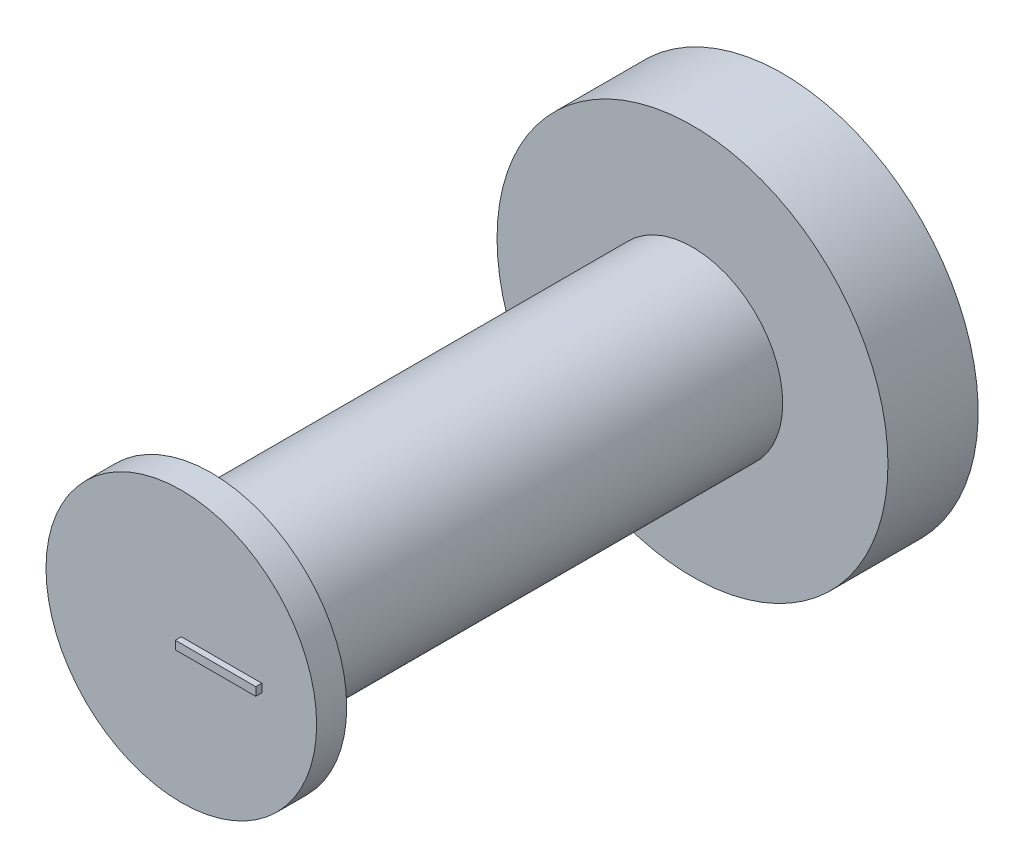
ISO-10303-21;
HEADER;
FILE_DESCRIPTION(('STEP AP214'),'2;1');
FILE_NAME('part.step','',(''),(''),'','','');
FILE_SCHEMA(('AUTOMOTIVE_DESIGN { 1 0 10303 214 1 1 1 1 }'));
ENDSEC;
DATA;
#1=APPLICATION_CONTEXT('core data for automotive mechanical design processes');
#2=APPLICATION_PROTOCOL_DEFINITION('international standard','automotive_design',2000,#1);
#3=PRODUCT_CONTEXT('',#1,'mechanical');
#4=PRODUCT('Part','Part','',(#3));
#5=PRODUCT_RELATED_PRODUCT_CATEGORY('part','',(#4));
#6=PRODUCT_DEFINITION_FORMATION('','',#4);
#7=PRODUCT_DEFINITION_CONTEXT('part definition',#1,'design');
#8=PRODUCT_DEFINITION('design','',#6,#7);
#9=PRODUCT_DEFINITION_SHAPE('','',#8);
#10=(LENGTH_UNIT() NAMED_UNIT(*) SI_UNIT(.MILLI.,.METRE.));
#11=(NAMED_UNIT(*) PLANE_ANGLE_UNIT() SI_UNIT($,.RADIAN.));
#12=(NAMED_UNIT(*) SI_UNIT($,.STERADIAN.) SOLID_ANGLE_UNIT());
#13=UNCERTAINTY_MEASURE_WITH_UNIT(LENGTH_MEASURE(1.E-05),#10,'distance_accuracy_value','');
#14=(GEOMETRIC_REPRESENTATION_CONTEXT(3) GLOBAL_UNCERTAINTY_ASSIGNED_CONTEXT((#13)) GLOBAL_UNIT_ASSIGNED_CONTEXT((#10,
#11,#12)) REPRESENTATION_CONTEXT('',''));
#15=CARTESIAN_POINT('',(0.,0.,0.));
#16=DIRECTION('',(0.,0.,1.));
#17=DIRECTION('',(1.,0.,0.));
#18=AXIS2_PLACEMENT_3D('',#15,#16,#17);
#19=CARTESIAN_POINT('',(0.,0.,10.35));
#20=DIRECTION('',(0.,0.,1.));
#21=DIRECTION('',(1.,0.,0.));
#22=AXIS2_PLACEMENT_3D('',#19,#20,#21);
#23=PLANE('',#22);
#24=CARTESIAN_POINT('',(0.,0.,10.35));
#25=DIRECTION('',(0.,0.,1.));
#26=DIRECTION('',(1.,0.,0.));
#27=AXIS2_PLACEMENT_3D('',#24,#25,#26);
#28=CIRCLE('',#27,10.35);
#29=CARTESIAN_POINT('',(10.35,0.,10.35));
#30=VERTEX_POINT('',#29);
#31=EDGE_CURVE('E37',#30,#30,#28,.T.);
#32=ORIENTED_EDGE('',*,*,#31,.F.);
#33=EDGE_LOOP('',(#32));
#34=FACE_BOUND('',#33,.T.);
#35=CARTESIAN_POINT('',(0.,0.,10.35));
#36=DIRECTION('',(0.,0.,1.));
#37=DIRECTION('',(1.,0.,0.));
#38=AXIS2_PLACEMENT_3D('',#35,#36,#37);
#39=CIRCLE('',#38,22.425);
#40=CARTESIAN_POINT('',(22.425,0.,10.35));
#41=VERTEX_POINT('',#40);
#42=EDGE_CURVE('E103',#41,#41,#39,.T.);
#43=ORIENTED_EDGE('',*,*,#42,.T.);
#44=EDGE_LOOP('',(#43));
#45=FACE_BOUND('',#44,.T.);
#46=ADVANCED_FACE('F33',(#34,#45),#23,.T.);
#47=CARTESIAN_POINT('',(0.,0.,69.));
#48=DIRECTION('',(0.,0.,1.));
#49=DIRECTION('',(1.,0.,0.));
#50=AXIS2_PLACEMENT_3D('',#47,#48,#49);
#51=PLANE('',#50);
#52=CARTESIAN_POINT('',(0.,0.,69.));
#53=DIRECTION('',(0.,0.,1.));
#54=DIRECTION('',(1.,0.,0.));
#55=AXIS2_PLACEMENT_3D('',#52,#53,#54);
#56=CIRCLE('',#55,15.525);
#57=CARTESIAN_POINT('',(15.525,0.,69.));
#58=VERTEX_POINT('',#57);
#59=EDGE_CURVE('E112',#58,#58,#56,.T.);
#60=ORIENTED_EDGE('',*,*,#59,.T.);
#61=EDGE_LOOP('',(#60));
#62=FACE_BOUND('',#61,.T.);
#63=DIRECTION('',(1.,0.,0.));
#64=VECTOR('',#63,1.);
#65=CARTESIAN_POINT('',(0.,0.,69.));
#66=LINE('',#65,#64);
#67=CARTESIAN_POINT('',(0.,0.,69.));
#68=VERTEX_POINT('',#67);
#69=CARTESIAN_POINT('',(9.23130868630594,0.,69.));
#70=VERTEX_POINT('',#69);
#71=EDGE_CURVE('E89',#68,#70,#66,.T.);
#72=ORIENTED_EDGE('',*,*,#71,.F.);
#73=DIRECTION('',(0.,-1.,0.));
#74=VECTOR('',#73,1.);
#75=CARTESIAN_POINT('',(0.,0.,69.));
#76=LINE('',#75,#74);
#77=CARTESIAN_POINT('',(0.,0.956903949190487,69.));
#78=VERTEX_POINT('',#77);
#79=EDGE_CURVE('E100',#78,#68,#76,.T.);
#80=ORIENTED_EDGE('',*,*,#79,.F.);
#81=DIRECTION('',(-1.,0.,0.));
#82=VECTOR('',#81,1.);
#83=CARTESIAN_POINT('',(0.,0.956903949190487,69.));
#84=LINE('',#83,#82);
#85=CARTESIAN_POINT('',(9.23130868630594,0.956903949190487,69.));
#86=VERTEX_POINT('',#85);
#87=EDGE_CURVE('E70',#86,#78,#84,.T.);
#88=ORIENTED_EDGE('',*,*,#87,.F.);
#89=DIRECTION('',(0.,1.,0.));
#90=VECTOR('',#89,1.);
#91=CARTESIAN_POINT('',(9.23130868630594,0.,69.));
#92=LINE('',#91,#90);
#93=EDGE_CURVE('E105',#70,#86,#92,.T.);
#94=ORIENTED_EDGE('',*,*,#93,.F.);
#95=EDGE_LOOP('',(#72,#80,#88,#94));
#96=FACE_BOUND('',#95,.T.);
#97=ADVANCED_FACE('F129',(#62,#96),#51,.T.);
#98=CARTESIAN_POINT('',(0.,0.,65.55));
#99=DIRECTION('',(0.,0.,-1.));
#100=DIRECTION('',(-1.,0.,0.));
#101=AXIS2_PLACEMENT_3D('',#98,#99,#100);
#102=CYLINDRICAL_SURFACE('',#101,10.35);
#103=CARTESIAN_POINT('',(0.,0.,65.55));
#104=DIRECTION('',(0.,0.,1.));
#105=DIRECTION('',(1.,0.,0.));
#106=AXIS2_PLACEMENT_3D('',#103,#104,#105);
#107=CIRCLE('',#106,10.35);
#108=CARTESIAN_POINT('',(10.35,0.,65.55));
#109=VERTEX_POINT('',#108);
#110=EDGE_CURVE('E11',#109,#109,#107,.T.);
#111=ORIENTED_EDGE('',*,*,#110,.F.);
#112=EDGE_LOOP('',(#111));
#113=FACE_BOUND('',#112,.T.);
#114=ORIENTED_EDGE('',*,*,#31,.T.);
#115=EDGE_LOOP('',(#114));
#116=FACE_BOUND('',#115,.T.);
#117=ADVANCED_FACE('F123',(#113,#116),#102,.T.);
#118=CARTESIAN_POINT('',(0.,0.,65.55));
#119=DIRECTION('',(0.,0.,1.));
#120=DIRECTION('',(1.,0.,0.));
#121=AXIS2_PLACEMENT_3D('',#118,#119,#120);
#122=PLANE('',#121);
#123=CARTESIAN_POINT('',(0.,0.,65.55));
#124=DIRECTION('',(0.,0.,1.));
#125=DIRECTION('',(1.,0.,0.));
#126=AXIS2_PLACEMENT_3D('',#123,#124,#125);
#127=CIRCLE('',#126,15.525);
#128=CARTESIAN_POINT('',(15.525,0.,65.55));
#129=VERTEX_POINT('',#128);
#130=EDGE_CURVE('E111',#129,#129,#127,.T.);
#131=ORIENTED_EDGE('',*,*,#130,.F.);
#132=EDGE_LOOP('',(#131));
#133=FACE_BOUND('',#132,.T.);
#134=ORIENTED_EDGE('',*,*,#110,.T.);
#135=EDGE_LOOP('',(#134));
#136=FACE_BOUND('',#135,.T.);
#137=ADVANCED_FACE('F120',(#133,#136),#122,.F.);
#138=CARTESIAN_POINT('',(0.,0.,69.));
#139=DIRECTION('',(0.,0.,-1.));
#140=DIRECTION('',(-1.,0.,0.));
#141=AXIS2_PLACEMENT_3D('',#138,#139,#140);
#142=CYLINDRICAL_SURFACE('',#141,15.525);
#143=ORIENTED_EDGE('',*,*,#59,.F.);
#144=EDGE_LOOP('',(#143));
#145=FACE_BOUND('',#144,.T.);
#146=ORIENTED_EDGE('',*,*,#130,.T.);
#147=EDGE_LOOP('',(#146));
#148=FACE_BOUND('',#147,.T.);
#149=ADVANCED_FACE('F118',(#145,#148),#142,.T.);
#150=CARTESIAN_POINT('',(0.,0.,69.69));
#151=DIRECTION('',(1.,0.,0.));
#152=DIRECTION('',(0.,0.,-1.));
#153=AXIS2_PLACEMENT_3D('',#150,#151,#152);
#154=PLANE('',#153);
#155=ORIENTED_EDGE('',*,*,#79,.T.);
#156=DIRECTION('',(0.,0.,-1.));
#157=VECTOR('',#156,1.);
#158=CARTESIAN_POINT('',(0.,0.,69.69));
#159=LINE('',#158,#157);
#160=CARTESIAN_POINT('',(0.,0.,69.69));
#161=VERTEX_POINT('',#160);
#162=EDGE_CURVE('E92',#161,#68,#159,.T.);
#163=ORIENTED_EDGE('',*,*,#162,.F.);
#164=DIRECTION('',(0.,-1.,0.));
#165=VECTOR('',#164,1.);
#166=CARTESIAN_POINT('',(0.,0.,69.69));
#167=LINE('',#166,#165);
#168=CARTESIAN_POINT('',(0.,0.956903949190487,69.69));
#169=VERTEX_POINT('',#168);
#170=EDGE_CURVE('E82',#169,#161,#167,.T.);
#171=ORIENTED_EDGE('',*,*,#170,.F.);
#172=DIRECTION('',(0.,0.,-1.));
#173=VECTOR('',#172,1.);
#174=CARTESIAN_POINT('',(0.,0.956903949190487,69.69));
#175=LINE('',#174,#173);
#176=EDGE_CURVE('E96',#169,#78,#175,.T.);
#177=ORIENTED_EDGE('',*,*,#176,.T.);
#178=EDGE_LOOP('',(#155,#163,#171,#177));
#179=FACE_BOUND('',#178,.T.);
#180=ADVANCED_FACE('F163',(#179),#154,.F.);
#181=CARTESIAN_POINT('',(0.,0.,69.69));
#182=DIRECTION('',(0.,1.,0.));
#183=DIRECTION('',(0.,0.,1.));
#184=AXIS2_PLACEMENT_3D('',#181,#182,#183);
#185=PLANE('',#184);
#186=ORIENTED_EDGE('',*,*,#71,.T.);
#187=DIRECTION('',(0.,0.,-1.));
#188=VECTOR('',#187,1.);
#189=CARTESIAN_POINT('',(9.23130868630594,0.,69.69));
#190=LINE('',#189,#188);
#191=CARTESIAN_POINT('',(9.23130868630594,0.,69.69));
#192=VERTEX_POINT('',#191);
#193=EDGE_CURVE('E86',#192,#70,#190,.T.);
#194=ORIENTED_EDGE('',*,*,#193,.F.);
#195=DIRECTION('',(1.,0.,0.));
#196=VECTOR('',#195,1.);
#197=CARTESIAN_POINT('',(0.,0.,69.69));
#198=LINE('',#197,#196);
#199=EDGE_CURVE('E77',#161,#192,#198,.T.);
#200=ORIENTED_EDGE('',*,*,#199,.F.);
#201=ORIENTED_EDGE('',*,*,#162,.T.);
#202=EDGE_LOOP('',(#186,#194,#200,#201));
#203=FACE_BOUND('',#202,.T.);
#204=ADVANCED_FACE('F87',(#203),#185,.F.);
#205=CARTESIAN_POINT('',(9.23130868630594,0.,69.69));
#206=DIRECTION('',(-1.,0.,0.));
#207=DIRECTION('',(0.,0.,1.));
#208=AXIS2_PLACEMENT_3D('',#205,#206,#207);
#209=PLANE('',#208);
#210=ORIENTED_EDGE('',*,*,#93,.T.);
#211=DIRECTION('',(0.,0.,-1.));
#212=VECTOR('',#211,1.);
#213=CARTESIAN_POINT('',(9.23130868630594,0.956903949190487,69.69));
#214=LINE('',#213,#212);
#215=CARTESIAN_POINT('',(9.23130868630594,0.956903949190487,69.69));
#216=VERTEX_POINT('',#215);
#217=EDGE_CURVE('E48',#216,#86,#214,.T.);
#218=ORIENTED_EDGE('',*,*,#217,.F.);
#219=DIRECTION('',(0.,1.,0.));
#220=VECTOR('',#219,1.);
#221=CARTESIAN_POINT('',(9.23130868630594,0.,69.69));
#222=LINE('',#221,#220);
#223=EDGE_CURVE('E80',#192,#216,#222,.T.);
#224=ORIENTED_EDGE('',*,*,#223,.F.);
#225=ORIENTED_EDGE('',*,*,#193,.T.);
#226=EDGE_LOOP('',(#210,#218,#224,#225));
#227=FACE_BOUND('',#226,.T.);
#228=ADVANCED_FACE('F94',(#227),#209,.F.);
#229=CARTESIAN_POINT('',(0.,0.956903949190487,69.69));
#230=DIRECTION('',(0.,-1.,0.));
#231=DIRECTION('',(0.,0.,-1.));
#232=AXIS2_PLACEMENT_3D('',#229,#230,#231);
#233=PLANE('',#232);
#234=ORIENTED_EDGE('',*,*,#87,.T.);
#235=ORIENTED_EDGE('',*,*,#176,.F.);
#236=DIRECTION('',(-1.,0.,0.));
#237=VECTOR('',#236,1.);
#238=CARTESIAN_POINT('',(0.,0.956903949190487,69.69));
#239=LINE('',#238,#237);
#240=EDGE_CURVE('E56',#216,#169,#239,.T.);
#241=ORIENTED_EDGE('',*,*,#240,.F.);
#242=ORIENTED_EDGE('',*,*,#217,.T.);
#243=EDGE_LOOP('',(#234,#235,#241,#242));
#244=FACE_BOUND('',#243,.T.);
#245=ADVANCED_FACE('F154',(#244),#233,.F.);
#246=CARTESIAN_POINT('',(0.,0.,69.69));
#247=DIRECTION('',(0.,0.,-1.));
#248=DIRECTION('',(-1.,0.,0.));
#249=AXIS2_PLACEMENT_3D('',#246,#247,#248);
#250=PLANE('',#249);
#251=ORIENTED_EDGE('',*,*,#170,.T.);
#252=ORIENTED_EDGE('',*,*,#199,.T.);
#253=ORIENTED_EDGE('',*,*,#223,.T.);
#254=ORIENTED_EDGE('',*,*,#240,.T.);
#255=EDGE_LOOP('',(#251,#252,#253,#254));
#256=FACE_BOUND('',#255,.T.);
#257=ADVANCED_FACE('F78',(#256),#250,.F.);
#258=CARTESIAN_POINT('',(0.,0.,14.49));
#259=DIRECTION('',(0.,0.,-1.));
#260=DIRECTION('',(-1.,0.,0.));
#261=AXIS2_PLACEMENT_3D('',#258,#259,#260);
#262=CYLINDRICAL_SURFACE('',#261,22.425);
#263=ORIENTED_EDGE('',*,*,#42,.F.);
#264=EDGE_LOOP('',(#263));
#265=FACE_BOUND('',#264,.T.);
#266=CARTESIAN_POINT('',(0.,0.,0.));
#267=DIRECTION('',(0.,0.,-1.));
#268=DIRECTION('',(-1.,0.,0.));
#269=AXIS2_PLACEMENT_3D('',#266,#267,#268);
#270=CIRCLE('',#269,22.425);
#271=CARTESIAN_POINT('',(-22.425,0.,0.));
#272=VERTEX_POINT('',#271);
#273=EDGE_CURVE('E139',#272,#272,#270,.T.);
#274=ORIENTED_EDGE('',*,*,#273,.F.);
#275=EDGE_LOOP('',(#274));
#276=FACE_BOUND('',#275,.T.);
#277=ADVANCED_FACE('F146',(#265,#276),#262,.T.);
#278=CARTESIAN_POINT('',(0.,0.,0.));
#279=DIRECTION('',(0.,0.,1.));
#280=DIRECTION('',(1.,0.,0.));
#281=AXIS2_PLACEMENT_3D('',#278,#279,#280);
#282=PLANE('',#281);
#283=ORIENTED_EDGE('',*,*,#273,.T.);
#284=EDGE_LOOP('',(#283));
#285=FACE_BOUND('',#284,.T.);
#286=ADVANCED_FACE('F35',(#285),#282,.F.);
#287=CLOSED_SHELL('',(#46,#97,#117,#137,#149,#180,#204,#228,#245,#257,#277,#286));
#288=MANIFOLD_SOLID_BREP('B2',#287);
#289=ADVANCED_BREP_SHAPE_REPRESENTATION('',(#18,#288),#14);
#290=SHAPE_DEFINITION_REPRESENTATION(#9,#289);
ENDSEC;
END-ISO-10303-21;
